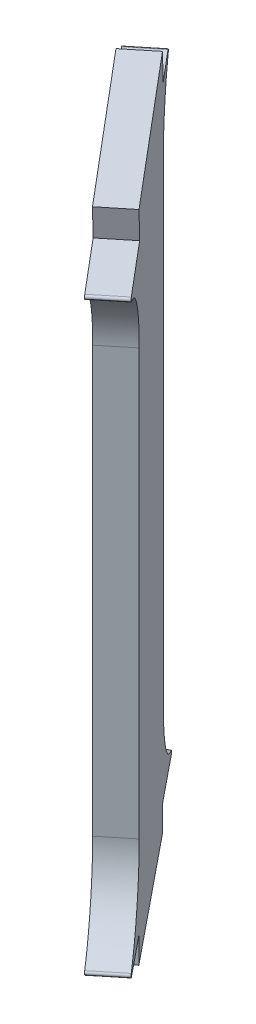
ISO-10303-21;
HEADER;
FILE_DESCRIPTION(('STEP AP214'),'2;1');
FILE_NAME('part.step','',(''),(''),'','','');
FILE_SCHEMA(('AUTOMOTIVE_DESIGN { 1 0 10303 214 1 1 1 1 }'));
ENDSEC;
DATA;
#1=APPLICATION_CONTEXT('core data for automotive mechanical design processes');
#2=APPLICATION_PROTOCOL_DEFINITION('international standard','automotive_design',2000,#1);
#3=PRODUCT_CONTEXT('',#1,'mechanical');
#4=PRODUCT('Part','Part','',(#3));
#5=PRODUCT_RELATED_PRODUCT_CATEGORY('part','',(#4));
#6=PRODUCT_DEFINITION_FORMATION('','',#4);
#7=PRODUCT_DEFINITION_CONTEXT('part definition',#1,'design');
#8=PRODUCT_DEFINITION('design','',#6,#7);
#9=PRODUCT_DEFINITION_SHAPE('','',#8);
#10=(LENGTH_UNIT() NAMED_UNIT(*) SI_UNIT(.MILLI.,.METRE.));
#11=(NAMED_UNIT(*) PLANE_ANGLE_UNIT() SI_UNIT($,.RADIAN.));
#12=(NAMED_UNIT(*) SI_UNIT($,.STERADIAN.) SOLID_ANGLE_UNIT());
#13=UNCERTAINTY_MEASURE_WITH_UNIT(LENGTH_MEASURE(1.E-05),#10,'distance_accuracy_value','');
#14=(GEOMETRIC_REPRESENTATION_CONTEXT(3) GLOBAL_UNCERTAINTY_ASSIGNED_CONTEXT((#13)) GLOBAL_UNIT_ASSIGNED_CONTEXT((#10,
#11,#12)) REPRESENTATION_CONTEXT('',''));
#15=CARTESIAN_POINT('',(0.,0.,0.));
#16=DIRECTION('',(0.,0.,1.));
#17=DIRECTION('',(1.,0.,0.));
#18=AXIS2_PLACEMENT_3D('',#15,#16,#17);
#19=CARTESIAN_POINT('',(-148.625427435059,71.2659206812055,-82.6031276055856));
#20=DIRECTION('',(-0.776187884580817,0.,0.630501679482264));
#21=DIRECTION('',(0.,1.,0.));
#22=AXIS2_PLACEMENT_3D('',#19,#20,#21);
#23=ELLIPSE('',#22,10.0702795953244,10.);
#24=DIRECTION('',(-0.776187884580817,0.,0.630501679482264));
#25=VECTOR('',#24,1.);
#26=SURFACE_OF_LINEAR_EXTRUSION('',#23,#25);
#27=CARTESIAN_POINT('',(-151.730178973383,71.2659206812055,-80.0811208876566));
#28=DIRECTION('',(-0.776187884580817,0.,0.630501679482264));
#29=DIRECTION('',(0.,1.,0.));
#30=AXIS2_PLACEMENT_3D('',#27,#28,#29);
#31=ELLIPSE('',#30,10.0702795953244,10.);
#32=CARTESIAN_POINT('',(-145.42516217856,71.265920681185,-72.3192420418484));
#33=VERTEX_POINT('',#32);
#34=CARTESIAN_POINT('',(-148.00880313571,79.3950440581068,-75.4998692698261));
#35=VERTEX_POINT('',#34);
#36=EDGE_CURVE('E184',#33,#35,#31,.T.);
#37=ORIENTED_EDGE('',*,*,#36,.T.);
#38=DIRECTION('',(-0.776187884580817,0.,0.630501679482264));
#39=VECTOR('',#38,1.);
#40=CARTESIAN_POINT('',(-148.00880313571,79.3950440581068,-75.4998692698261));
#41=LINE('',#40,#39);
#42=CARTESIAN_POINT('',(-144.904051597387,79.3950440581068,-78.0218759877551));
#43=VERTEX_POINT('',#42);
#44=EDGE_CURVE('E270',#35,#43,#41,.F.);
#45=ORIENTED_EDGE('',*,*,#44,.T.);
#46=CARTESIAN_POINT('',(-142.320410640237,71.265920681185,-74.8412487597775));
#47=VERTEX_POINT('',#46);
#48=EDGE_CURVE('E227',#47,#43,#23,.T.);
#49=ORIENTED_EDGE('',*,*,#48,.F.);
#50=DIRECTION('',(0.776187884580817,0.,-0.630501679482264));
#51=VECTOR('',#50,1.);
#52=CARTESIAN_POINT('',(-142.320410640237,71.265920681185,-74.8412487597775));
#53=LINE('',#52,#51);
#54=EDGE_CURVE('E331',#33,#47,#53,.T.);
#55=ORIENTED_EDGE('',*,*,#54,.F.);
#56=EDGE_LOOP('',(#37,#45,#49,#55));
#57=FACE_BOUND('',#56,.T.);
#58=ADVANCED_FACE('F36',(#57),#26,.F.);
#59=CARTESIAN_POINT('',(-123.405360255769,65.417589735172,-51.5556122223529));
#60=DIRECTION('',(-0.776187884580817,0.,0.630501679482264));
#61=DIRECTION('',(0.,-1.,0.));
#62=AXIS2_PLACEMENT_3D('',#59,#60,#61);
#63=ELLIPSE('',#62,10.0702795953244,10.);
#64=DIRECTION('',(-0.776187884580817,0.,0.630501679482264));
#65=VECTOR('',#64,1.);
#66=SURFACE_OF_LINEAR_EXTRUSION('',#63,#65);
#67=CARTESIAN_POINT('',(-125.525555398606,74.9014287887686,-54.1657080180832));
#68=VERTEX_POINT('',#67);
#69=CARTESIAN_POINT('',(-129.710377050591,65.4175897351479,-59.3174910681611));
#70=VERTEX_POINT('',#69);
#71=EDGE_CURVE('E293',#68,#70,#63,.T.);
#72=ORIENTED_EDGE('',*,*,#71,.F.);
#73=DIRECTION('',(-0.776187884580817,0.,0.630501679482264));
#74=VECTOR('',#73,1.);
#75=CARTESIAN_POINT('',(-125.525555398606,74.9014287887686,-54.1657080180832));
#76=LINE('',#75,#74);
#77=CARTESIAN_POINT('',(-128.63030693693,74.9014287887686,-51.6437013001541));
#78=VERTEX_POINT('',#77);
#79=EDGE_CURVE('E44',#68,#78,#76,.T.);
#80=ORIENTED_EDGE('',*,*,#79,.T.);
#81=CARTESIAN_POINT('',(-126.510111794092,65.417589735172,-49.0336055044239));
#82=DIRECTION('',(-0.776187884580817,0.,0.630501679482264));
#83=DIRECTION('',(0.,-1.,0.));
#84=AXIS2_PLACEMENT_3D('',#81,#82,#83);
#85=ELLIPSE('',#84,10.0702795953244,10.);
#86=CARTESIAN_POINT('',(-132.815128588915,65.4175897351479,-56.795484350232));
#87=VERTEX_POINT('',#86);
#88=EDGE_CURVE('E291',#78,#87,#85,.T.);
#89=ORIENTED_EDGE('',*,*,#88,.T.);
#90=DIRECTION('',(0.776187884580817,0.,-0.630501679482264));
#91=VECTOR('',#90,1.);
#92=CARTESIAN_POINT('',(-129.710377050591,65.4175897351479,-59.3174910681611));
#93=LINE('',#92,#91);
#94=EDGE_CURVE('E325',#87,#70,#93,.T.);
#95=ORIENTED_EDGE('',*,*,#94,.T.);
#96=EDGE_LOOP('',(#72,#80,#89,#95));
#97=FACE_BOUND('',#96,.T.);
#98=ADVANCED_FACE('F236',(#97),#66,.F.);
#99=CARTESIAN_POINT('',(-192.,4.1,-136.));
#100=DIRECTION('',(0.,-1.,0.));
#101=DIRECTION('',(0.630501679482264,0.,0.776187884580817));
#102=AXIS2_PLACEMENT_3D('',#99,#100,#101);
#103=PLANE('',#102);
#104=DIRECTION('',(0.630501679482264,0.,0.776187884580817));
#105=VECTOR('',#104,1.);
#106=CARTESIAN_POINT('',(-195.104751538323,4.1,-133.477993282071));
#107=LINE('',#106,#105);
#108=CARTESIAN_POINT('',(-149.551524234372,4.1,-77.3990575908655));
#109=VERTEX_POINT('',#108);
#110=CARTESIAN_POINT('',(-144.896874259221,4.1,-71.6688858320161));
#111=VERTEX_POINT('',#110);
#112=EDGE_CURVE('E313',#109,#111,#107,.T.);
#113=ORIENTED_EDGE('',*,*,#112,.F.);
#114=DIRECTION('',(-0.776187884580817,0.,0.630501679482264));
#115=VECTOR('',#114,1.);
#116=CARTESIAN_POINT('',(-146.446772696049,4.1,-79.9210643087945));
#117=LINE('',#116,#115);
#118=CARTESIAN_POINT('',(-146.446772696049,4.1,-79.9210643087945));
#119=VERTEX_POINT('',#118);
#120=EDGE_CURVE('E282',#109,#119,#117,.F.);
#121=ORIENTED_EDGE('',*,*,#120,.T.);
#122=DIRECTION('',(0.630501679482264,0.,0.776187884580817));
#123=VECTOR('',#122,1.);
#124=CARTESIAN_POINT('',(-192.,4.1,-136.));
#125=LINE('',#124,#123);
#126=CARTESIAN_POINT('',(-141.792122720898,4.1,-74.1908925499451));
#127=VERTEX_POINT('',#126);
#128=EDGE_CURVE('E219',#119,#127,#125,.T.);
#129=ORIENTED_EDGE('',*,*,#128,.T.);
#130=DIRECTION('',(0.776187884580817,0.,-0.630501679482264));
#131=VECTOR('',#130,1.);
#132=CARTESIAN_POINT('',(-141.792122720898,4.1,-74.1908925499451));
#133=LINE('',#132,#131);
#134=EDGE_CURVE('E195',#111,#127,#133,.T.);
#135=ORIENTED_EDGE('',*,*,#134,.F.);
#136=EDGE_LOOP('',(#113,#121,#129,#135));
#137=FACE_BOUND('',#136,.T.);
#138=ADVANCED_FACE('F246',(#137),#103,.T.);
#139=CARTESIAN_POINT('',(-148.625427435059,14.00000000001,-82.6031276055856));
#140=DIRECTION('',(-0.776187884580817,0.,0.630501679482264));
#141=DIRECTION('',(0.630501679482264,0.,0.776187884580817));
#142=AXIS2_PLACEMENT_3D('',#139,#140,#141);
#143=CYLINDRICAL_SURFACE('',#142,10.);
#144=CARTESIAN_POINT('',(-148.625427435059,14.00000000001,-82.6031276055856));
#145=DIRECTION('',(-0.776187884580817,0.,0.630501679482264));
#146=DIRECTION('',(0.630501679482264,0.,0.776187884580817));
#147=AXIS2_PLACEMENT_3D('',#144,#145,#146);
#148=CIRCLE('',#147,10.);
#149=CARTESIAN_POINT('',(-146.499910616513,4.58536585365878,-79.986480486765));
#150=VERTEX_POINT('',#149);
#151=CARTESIAN_POINT('',(-142.320410640237,14.00000000001,-74.8412487597775));
#152=VERTEX_POINT('',#151);
#153=EDGE_CURVE('E221',#150,#152,#148,.T.);
#154=ORIENTED_EDGE('',*,*,#153,.F.);
#155=DIRECTION('',(-0.776187884580817,0.,0.630501679482264));
#156=VECTOR('',#155,1.);
#157=CARTESIAN_POINT('',(-146.499910616513,4.58536585365878,-79.986480486765));
#158=LINE('',#157,#156);
#159=CARTESIAN_POINT('',(-149.604662154836,4.58536585365878,-77.464473768836));
#160=VERTEX_POINT('',#159);
#161=EDGE_CURVE('E285',#150,#160,#158,.T.);
#162=ORIENTED_EDGE('',*,*,#161,.T.);
#163=CARTESIAN_POINT('',(-151.730178973383,14.00000000001,-80.0811208876566));
#164=DIRECTION('',(-0.776187884580817,0.,0.630501679482264));
#165=DIRECTION('',(0.630501679482264,0.,0.776187884580817));
#166=AXIS2_PLACEMENT_3D('',#163,#164,#165);
#167=CIRCLE('',#166,10.);
#168=CARTESIAN_POINT('',(-145.42516217856,14.00000000001,-72.3192420418484));
#169=VERTEX_POINT('',#168);
#170=EDGE_CURVE('E311',#160,#169,#167,.T.);
#171=ORIENTED_EDGE('',*,*,#170,.T.);
#172=DIRECTION('',(0.776187884580817,0.,-0.630501679482264));
#173=VECTOR('',#172,1.);
#174=CARTESIAN_POINT('',(-142.320410640237,14.00000000001,-74.8412487597775));
#175=LINE('',#174,#173);
#176=EDGE_CURVE('E333',#169,#152,#175,.T.);
#177=ORIENTED_EDGE('',*,*,#176,.T.);
#178=EDGE_LOOP('',(#154,#162,#171,#177));
#179=FACE_BOUND('',#178,.T.);
#180=ADVANCED_FACE('F242',(#179),#143,.F.);
#181=CARTESIAN_POINT('',(-142.320410640237,500000.,-74.8412487597775));
#182=DIRECTION('',(-0.630501679482264,0.,-0.776187884580817));
#183=DIRECTION('',(0.,-1.,0.));
#184=AXIS2_PLACEMENT_3D('',#181,#182,#183);
#185=PLANE('',#184);
#186=ORIENTED_EDGE('',*,*,#176,.F.);
#187=DIRECTION('',(0.,1.,0.));
#188=VECTOR('',#187,1.);
#189=CARTESIAN_POINT('',(-145.42516217856,4.,-72.3192420418484));
#190=LINE('',#189,#188);
#191=EDGE_CURVE('E308',#33,#169,#190,.F.);
#192=ORIENTED_EDGE('',*,*,#191,.F.);
#193=ORIENTED_EDGE('',*,*,#54,.T.);
#194=DIRECTION('',(0.,-1.,0.));
#195=VECTOR('',#194,1.);
#196=CARTESIAN_POINT('',(-142.320410640237,500000.,-74.8412487597775));
#197=LINE('',#196,#195);
#198=EDGE_CURVE('E224',#47,#152,#197,.T.);
#199=ORIENTED_EDGE('',*,*,#198,.T.);
#200=EDGE_LOOP('',(#186,#192,#193,#199));
#201=FACE_BOUND('',#200,.T.);
#202=ADVANCED_FACE('F239',(#201),#185,.T.);
#203=CARTESIAN_POINT('',(-150.057830245351,-5.72605217805807,-84.3665070593891));
#204=DIRECTION('',(-0.623868762401143,0.144670153472483,-0.768022339515144));
#205=DIRECTION('',(-0.0912147747353571,-0.989479937489512,-0.112291220385788));
#206=AXIS2_PLACEMENT_3D('',#203,#204,#205);
#207=PLANE('',#206);
#208=DIRECTION('',(-0.0912147747353571,-0.989479937489512,-0.112291220385788));
#209=VECTOR('',#208,1.);
#210=CARTESIAN_POINT('',(-150.057830245351,-5.72605217805807,-84.3665070593891));
#211=LINE('',#210,#209);
#212=CARTESIAN_POINT('',(-141.888727009523,82.8907731398083,-74.3098186065594));
#213=VERTEX_POINT('',#212);
#214=CARTESIAN_POINT('',(-142.224414265649,79.2493038036132,-74.7230710842158));
#215=VERTEX_POINT('',#214);
#216=EDGE_CURVE('E199',#213,#215,#211,.T.);
#217=ORIENTED_EDGE('',*,*,#216,.T.);
#218=DIRECTION('',(0.77618788458082,0.,-0.630501679482261));
#219=VECTOR('',#218,1.);
#220=CARTESIAN_POINT('',(-145.329165803972,79.2493038036132,-72.2010643662867));
#221=LINE('',#220,#219);
#222=CARTESIAN_POINT('',(-145.329165803972,79.2493038036132,-72.2010643662867));
#223=VERTEX_POINT('',#222);
#224=EDGE_CURVE('E190',#223,#215,#221,.T.);
#225=ORIENTED_EDGE('',*,*,#224,.F.);
#226=DIRECTION('',(-0.0912147747353571,-0.989479937489512,-0.112291220385788));
#227=VECTOR('',#226,1.);
#228=CARTESIAN_POINT('',(-153.162581783674,-5.72605217805807,-81.8445003414601));
#229=LINE('',#228,#227);
#230=CARTESIAN_POINT('',(-144.993478547847,82.8907731398083,-71.7878118886303));
#231=VERTEX_POINT('',#230);
#232=EDGE_CURVE('E173',#231,#223,#229,.T.);
#233=ORIENTED_EDGE('',*,*,#232,.F.);
#234=DIRECTION('',(0.776187884580817,0.,-0.630501679482264));
#235=VECTOR('',#234,1.);
#236=CARTESIAN_POINT('',(-141.888727009523,82.8907731398083,-74.3098186065594));
#237=LINE('',#236,#235);
#238=EDGE_CURVE('E329',#231,#213,#237,.T.);
#239=ORIENTED_EDGE('',*,*,#238,.T.);
#240=EDGE_LOOP('',(#217,#225,#233,#239));
#241=FACE_BOUND('',#240,.T.);
#242=ADVANCED_FACE('F197',(#241),#207,.T.);
#243=CARTESIAN_POINT('',(-141.888727009523,82.8907731398083,-74.3098186065594));
#244=DIRECTION('',(-0.091214774735358,-0.989479937489512,-0.112291220385789));
#245=DIRECTION('',(0.623868762401143,-0.144670153472484,0.768022339515143));
#246=AXIS2_PLACEMENT_3D('',#243,#244,#245);
#247=PLANE('',#246);
#248=ORIENTED_EDGE('',*,*,#238,.F.);
#249=DIRECTION('',(0.623868762401143,-0.144670153472484,0.768022339515143));
#250=VECTOR('',#249,1.);
#251=CARTESIAN_POINT('',(-144.993478547847,82.8907731398083,-71.7878118886303));
#252=LINE('',#251,#250);
#253=CARTESIAN_POINT('',(-132.703263928544,80.0407711164004,-56.6577718001821));
#254=VERTEX_POINT('',#253);
#255=EDGE_CURVE('E181',#231,#254,#252,.T.);
#256=ORIENTED_EDGE('',*,*,#255,.T.);
#257=DIRECTION('',(0.776187884580817,0.,-0.630501679482264));
#258=VECTOR('',#257,1.);
#259=CARTESIAN_POINT('',(-129.598512390221,80.0407711164004,-59.1797785181111));
#260=LINE('',#259,#258);
#261=CARTESIAN_POINT('',(-129.598512390221,80.0407711164004,-59.1797785181111));
#262=VERTEX_POINT('',#261);
#263=EDGE_CURVE('E327',#254,#262,#260,.T.);
#264=ORIENTED_EDGE('',*,*,#263,.T.);
#265=DIRECTION('',(0.623868762401143,-0.144670153472484,0.768022339515143));
#266=VECTOR('',#265,1.);
#267=CARTESIAN_POINT('',(-141.888727009523,82.8907731398083,-74.3098186065594));
#268=LINE('',#267,#266);
#269=EDGE_CURVE('E402',#213,#262,#268,.T.);
#270=ORIENTED_EDGE('',*,*,#269,.F.);
#271=EDGE_LOOP('',(#248,#256,#264,#270));
#272=FACE_BOUND('',#271,.T.);
#273=ADVANCED_FACE('F405',(#272),#247,.F.);
#274=CARTESIAN_POINT('',(-137.767615626048,-8.57605420146593,-69.2364669709408));
#275=DIRECTION('',(0.623868762401143,-0.144670153472482,0.768022339515144));
#276=DIRECTION('',(0.0912147747353567,0.989479937489512,0.112291220385788));
#277=AXIS2_PLACEMENT_3D('',#274,#275,#276);
#278=PLANE('',#277);
#279=ORIENTED_EDGE('',*,*,#263,.F.);
#280=DIRECTION('',(0.0912147747353567,0.989479937489512,0.112291220385788));
#281=VECTOR('',#280,1.);
#282=CARTESIAN_POINT('',(-140.872367164371,-8.57605420146593,-66.7144602530117));
#283=LINE('',#282,#281);
#284=CARTESIAN_POINT('',(-133.038951184669,76.3993017802053,-57.0710242778384));
#285=VERTEX_POINT('',#284);
#286=EDGE_CURVE('E299',#285,#254,#283,.T.);
#287=ORIENTED_EDGE('',*,*,#286,.F.);
#288=DIRECTION('',(-0.776187884580818,0.,0.630501679482263));
#289=VECTOR('',#288,1.);
#290=CARTESIAN_POINT('',(-129.934199646346,76.3993017802053,-59.5930309957674));
#291=LINE('',#290,#289);
#292=CARTESIAN_POINT('',(-129.934199646346,76.3993017802053,-59.5930309957674));
#293=VERTEX_POINT('',#292);
#294=EDGE_CURVE('E203',#293,#285,#291,.T.);
#295=ORIENTED_EDGE('',*,*,#294,.F.);
#296=DIRECTION('',(0.0912147747353567,0.989479937489512,0.112291220385788));
#297=VECTOR('',#296,1.);
#298=CARTESIAN_POINT('',(-137.767615626048,-8.57605420146593,-69.2364669709408));
#299=LINE('',#298,#297);
#300=EDGE_CURVE('E406',#293,#262,#299,.T.);
#301=ORIENTED_EDGE('',*,*,#300,.T.);
#302=EDGE_LOOP('',(#279,#287,#295,#301));
#303=FACE_BOUND('',#302,.T.);
#304=ADVANCED_FACE('F415',(#303),#278,.T.);
#305=CARTESIAN_POINT('',(-129.710377050591,500000.,-59.3174910681611));
#306=DIRECTION('',(-0.630501679482264,0.,-0.776187884580817));
#307=DIRECTION('',(0.,-1.,0.));
#308=AXIS2_PLACEMENT_3D('',#305,#306,#307);
#309=PLANE('',#308);
#310=ORIENTED_EDGE('',*,*,#94,.F.);
#311=DIRECTION('',(0.,1.,0.));
#312=VECTOR('',#311,1.);
#313=CARTESIAN_POINT('',(-132.815128588915,4.,-56.795484350232));
#314=LINE('',#313,#312);
#315=CARTESIAN_POINT('',(-132.815128588915,14.00000000001,-56.795484350232));
#316=VERTEX_POINT('',#315);
#317=EDGE_CURVE('E298',#87,#316,#314,.F.);
#318=ORIENTED_EDGE('',*,*,#317,.T.);
#319=DIRECTION('',(0.776187884580817,0.,-0.630501679482264));
#320=VECTOR('',#319,1.);
#321=CARTESIAN_POINT('',(-129.710377050591,14.00000000001,-59.3174910681611));
#322=LINE('',#321,#320);
#323=CARTESIAN_POINT('',(-129.710377050591,14.00000000001,-59.3174910681611));
#324=VERTEX_POINT('',#323);
#325=EDGE_CURVE('E323',#316,#324,#322,.T.);
#326=ORIENTED_EDGE('',*,*,#325,.T.);
#327=DIRECTION('',(0.,-1.,0.));
#328=VECTOR('',#327,1.);
#329=CARTESIAN_POINT('',(-129.710377050591,500000.,-59.3174910681611));
#330=LINE('',#329,#328);
#331=EDGE_CURVE('E371',#70,#324,#330,.T.);
#332=ORIENTED_EDGE('',*,*,#331,.F.);
#333=EDGE_LOOP('',(#310,#318,#326,#332));
#334=FACE_BOUND('',#333,.T.);
#335=ADVANCED_FACE('F413',(#334),#309,.F.);
#336=CARTESIAN_POINT('',(-123.405360255769,14.00000000001,-51.5556122223529));
#337=DIRECTION('',(-0.776187884580817,0.,0.630501679482264));
#338=DIRECTION('',(0.630501679482264,0.,0.776187884580817));
#339=AXIS2_PLACEMENT_3D('',#336,#337,#338);
#340=CYLINDRICAL_SURFACE('',#339,10.);
#341=CARTESIAN_POINT('',(-126.510111794092,14.00000000001,-49.0336055044239));
#342=DIRECTION('',(-0.776187884580817,0.,0.630501679482264));
#343=DIRECTION('',(0.630501679482264,0.,0.776187884580817));
#344=AXIS2_PLACEMENT_3D('',#341,#342,#343);
#345=CIRCLE('',#344,10.);
#346=CARTESIAN_POINT('',(-128.635628612639,4.58536585365878,-51.6502526232445));
#347=VERTEX_POINT('',#346);
#348=EDGE_CURVE('E301',#316,#347,#345,.T.);
#349=ORIENTED_EDGE('',*,*,#348,.T.);
#350=DIRECTION('',(-0.776187884580817,0.,0.630501679482264));
#351=VECTOR('',#350,1.);
#352=CARTESIAN_POINT('',(-125.530877074316,4.58536585365878,-54.1722593411735));
#353=LINE('',#352,#351);
#354=CARTESIAN_POINT('',(-125.530877074316,4.58536585365878,-54.1722593411735));
#355=VERTEX_POINT('',#354);
#356=EDGE_CURVE('E194',#347,#355,#353,.F.);
#357=ORIENTED_EDGE('',*,*,#356,.T.);
#358=CARTESIAN_POINT('',(-123.405360255769,14.00000000001,-51.5556122223529));
#359=DIRECTION('',(-0.776187884580817,0.,0.630501679482264));
#360=DIRECTION('',(0.630501679482264,0.,0.776187884580817));
#361=AXIS2_PLACEMENT_3D('',#358,#359,#360);
#362=CIRCLE('',#361,10.);
#363=EDGE_CURVE('E367',#324,#355,#362,.T.);
#364=ORIENTED_EDGE('',*,*,#363,.F.);
#365=ORIENTED_EDGE('',*,*,#325,.F.);
#366=EDGE_LOOP('',(#349,#357,#364,#365));
#367=FACE_BOUND('',#366,.T.);
#368=ADVANCED_FACE('F366',(#367),#340,.F.);
#369=CARTESIAN_POINT('',(-129.503925310562,4.1,-59.0633357747234));
#370=VERTEX_POINT('',#369);
#371=CARTESIAN_POINT('',(-125.584014994779,4.1,-54.237675519144));
#372=VERTEX_POINT('',#371);
#373=EDGE_CURVE('E222',#370,#372,#125,.T.);
#374=ORIENTED_EDGE('',*,*,#373,.T.);
#375=DIRECTION('',(-0.776187884580817,0.,0.630501679482264));
#376=VECTOR('',#375,1.);
#377=CARTESIAN_POINT('',(-125.584014994779,4.1,-54.237675519144));
#378=LINE('',#377,#376);
#379=CARTESIAN_POINT('',(-128.688766533103,4.1,-51.715668801215));
#380=VERTEX_POINT('',#379);
#381=EDGE_CURVE('E277',#372,#380,#378,.T.);
#382=ORIENTED_EDGE('',*,*,#381,.T.);
#383=DIRECTION('',(0.630501679482264,0.,0.776187884580817));
#384=VECTOR('',#383,1.);
#385=CARTESIAN_POINT('',(-195.104751538323,4.1,-133.477993282071));
#386=LINE('',#385,#384);
#387=CARTESIAN_POINT('',(-132.608676848885,4.1,-56.5413290567943));
#388=VERTEX_POINT('',#387);
#389=EDGE_CURVE('E354',#388,#380,#386,.T.);
#390=ORIENTED_EDGE('',*,*,#389,.F.);
#391=DIRECTION('',(0.776187884580817,0.,-0.630501679482264));
#392=VECTOR('',#391,1.);
#393=CARTESIAN_POINT('',(-129.503925310562,4.1,-59.0633357747234));
#394=LINE('',#393,#392);
#395=EDGE_CURVE('E320',#388,#370,#394,.T.);
#396=ORIENTED_EDGE('',*,*,#395,.T.);
#397=EDGE_LOOP('',(#374,#382,#390,#396));
#398=FACE_BOUND('',#397,.T.);
#399=ADVANCED_FACE('F353',(#398),#103,.T.);
#400=CARTESIAN_POINT('',(-129.503925310562,4.,-59.0633357747234));
#401=DIRECTION('',(-0.630501679482264,0.,-0.776187884580817));
#402=DIRECTION('',(0.,-1.,0.));
#403=AXIS2_PLACEMENT_3D('',#400,#401,#402);
#404=PLANE('',#403);
#405=ORIENTED_EDGE('',*,*,#395,.F.);
#406=DIRECTION('',(0.,1.,0.));
#407=VECTOR('',#406,1.);
#408=CARTESIAN_POINT('',(-132.608676848885,4.,-56.5413290567943));
#409=LINE('',#408,#407);
#410=CARTESIAN_POINT('',(-132.608676848885,1.,-56.5413290567943));
#411=VERTEX_POINT('',#410);
#412=EDGE_CURVE('E216',#388,#411,#409,.F.);
#413=ORIENTED_EDGE('',*,*,#412,.T.);
#414=DIRECTION('',(0.776187884580817,0.,-0.630501679482264));
#415=VECTOR('',#414,1.);
#416=CARTESIAN_POINT('',(-129.503925310562,1.,-59.0633357747234));
#417=LINE('',#416,#415);
#418=CARTESIAN_POINT('',(-129.503925310562,1.,-59.0633357747234));
#419=VERTEX_POINT('',#418);
#420=EDGE_CURVE('E318',#411,#419,#417,.T.);
#421=ORIENTED_EDGE('',*,*,#420,.T.);
#422=DIRECTION('',(0.,-1.,0.));
#423=VECTOR('',#422,1.);
#424=CARTESIAN_POINT('',(-129.503925310562,4.,-59.0633357747234));
#425=LINE('',#424,#423);
#426=EDGE_CURVE('E338',#370,#419,#425,.T.);
#427=ORIENTED_EDGE('',*,*,#426,.F.);
#428=EDGE_LOOP('',(#405,#413,#421,#427));
#429=FACE_BOUND('',#428,.T.);
#430=ADVANCED_FACE('F380',(#429),#404,.F.);
#431=CARTESIAN_POINT('',(-192.,1.,-136.));
#432=DIRECTION('',(0.,-1.,0.));
#433=DIRECTION('',(0.630501679482264,0.,0.776187884580817));
#434=AXIS2_PLACEMENT_3D('',#431,#432,#433);
#435=PLANE('',#434);
#436=ORIENTED_EDGE('',*,*,#420,.F.);
#437=DIRECTION('',(0.630501679482264,0.,0.776187884580817));
#438=VECTOR('',#437,1.);
#439=CARTESIAN_POINT('',(-195.104751538323,1.,-133.477993282071));
#440=LINE('',#439,#438);
#441=CARTESIAN_POINT('',(-144.896874259221,1.,-71.6688858320161));
#442=VERTEX_POINT('',#441);
#443=EDGE_CURVE('E211',#442,#411,#440,.T.);
#444=ORIENTED_EDGE('',*,*,#443,.F.);
#445=DIRECTION('',(0.776187884580817,0.,-0.630501679482264));
#446=VECTOR('',#445,1.);
#447=CARTESIAN_POINT('',(-141.792122720898,1.,-74.1908925499452));
#448=LINE('',#447,#446);
#449=CARTESIAN_POINT('',(-141.792122720898,1.,-74.1908925499452));
#450=VERTEX_POINT('',#449);
#451=EDGE_CURVE('E321',#442,#450,#448,.T.);
#452=ORIENTED_EDGE('',*,*,#451,.T.);
#453=DIRECTION('',(0.630501679482264,0.,0.776187884580817));
#454=VECTOR('',#453,1.);
#455=CARTESIAN_POINT('',(-192.,1.,-136.));
#456=LINE('',#455,#454);
#457=EDGE_CURVE('E212',#450,#419,#456,.T.);
#458=ORIENTED_EDGE('',*,*,#457,.T.);
#459=EDGE_LOOP('',(#436,#444,#452,#458));
#460=FACE_BOUND('',#459,.T.);
#461=ADVANCED_FACE('F252',(#460),#435,.T.);
#462=CARTESIAN_POINT('',(-141.792122720898,4.,-74.1908925499451));
#463=DIRECTION('',(0.630501679482264,0.,0.776187884580817));
#464=DIRECTION('',(0.,1.,0.));
#465=AXIS2_PLACEMENT_3D('',#462,#463,#464);
#466=PLANE('',#465);
#467=DIRECTION('',(0.,1.,0.));
#468=VECTOR('',#467,1.);
#469=CARTESIAN_POINT('',(-144.896874259221,4.,-71.6688858320161));
#470=LINE('',#469,#468);
#471=EDGE_CURVE('E315',#442,#111,#470,.T.);
#472=ORIENTED_EDGE('',*,*,#471,.T.);
#473=ORIENTED_EDGE('',*,*,#134,.T.);
#474=DIRECTION('',(0.,1.,0.));
#475=VECTOR('',#474,1.);
#476=CARTESIAN_POINT('',(-141.792122720898,4.,-74.1908925499451));
#477=LINE('',#476,#475);
#478=EDGE_CURVE('E215',#450,#127,#477,.T.);
#479=ORIENTED_EDGE('',*,*,#478,.F.);
#480=ORIENTED_EDGE('',*,*,#451,.F.);
#481=EDGE_LOOP('',(#472,#473,#479,#480));
#482=FACE_BOUND('',#481,.T.);
#483=ADVANCED_FACE('F248',(#482),#466,.F.);
#484=CARTESIAN_POINT('',(-192.,4.,-136.));
#485=DIRECTION('',(-0.776187884580817,0.,0.630501679482264));
#486=DIRECTION('',(0.630501679482264,0.,0.776187884580817));
#487=AXIS2_PLACEMENT_3D('',#484,#485,#486);
#488=PLANE('',#487);
#489=ORIENTED_EDGE('',*,*,#363,.T.);
#490=CARTESIAN_POINT('',(-125.584014994779,4.35,-54.237675519144));
#491=DIRECTION('',(-0.776187884580817,0.,0.630501679482264));
#492=DIRECTION('',(0.630501679482264,0.,0.776187884580817));
#493=AXIS2_PLACEMENT_3D('',#490,#491,#492);
#494=CIRCLE('',#493,0.25);
#495=EDGE_CURVE('E348',#355,#372,#494,.F.);
#496=ORIENTED_EDGE('',*,*,#495,.T.);
#497=ORIENTED_EDGE('',*,*,#373,.F.);
#498=ORIENTED_EDGE('',*,*,#426,.T.);
#499=ORIENTED_EDGE('',*,*,#457,.F.);
#500=ORIENTED_EDGE('',*,*,#478,.T.);
#501=ORIENTED_EDGE('',*,*,#128,.F.);
#502=CARTESIAN_POINT('',(-146.446772696049,4.35,-79.9210643087945));
#503=DIRECTION('',(-0.776187884580817,0.,0.630501679482264));
#504=DIRECTION('',(0.630501679482264,0.,0.776187884580817));
#505=AXIS2_PLACEMENT_3D('',#502,#503,#504);
#506=CIRCLE('',#505,0.25);
#507=EDGE_CURVE('E346',#119,#150,#506,.F.);
#508=ORIENTED_EDGE('',*,*,#507,.T.);
#509=ORIENTED_EDGE('',*,*,#153,.T.);
#510=ORIENTED_EDGE('',*,*,#198,.F.);
#511=ORIENTED_EDGE('',*,*,#48,.T.);
#512=CARTESIAN_POINT('',(-144.810592697142,79.5963598252793,-77.9068221053667));
#513=DIRECTION('',(-0.776187884580817,0.,0.630501679482264));
#514=DIRECTION('',(0.630501679482264,0.,0.776187884580817));
#515=AXIS2_PLACEMENT_3D('',#512,#513,#514);
#516=CIRCLE('',#515,0.25);
#517=CARTESIAN_POINT('',(-144.787789003458,79.8437298096517,-77.8787493002703));
#518=VERTEX_POINT('',#517);
#519=EDGE_CURVE('E344',#43,#518,#516,.F.);
#520=ORIENTED_EDGE('',*,*,#519,.T.);
#521=DIRECTION('',(-0.623868762401145,0.144670153472482,-0.768022339515142));
#522=VECTOR('',#521,1.);
#523=CARTESIAN_POINT('',(-142.224414265649,79.2493038036132,-74.7230710842158));
#524=LINE('',#523,#522);
#525=EDGE_CURVE('E201',#215,#518,#524,.T.);
#526=ORIENTED_EDGE('',*,*,#525,.F.);
#527=ORIENTED_EDGE('',*,*,#216,.F.);
#528=ORIENTED_EDGE('',*,*,#269,.T.);
#529=ORIENTED_EDGE('',*,*,#300,.F.);
#530=DIRECTION('',(-0.623868762401147,0.144670153472482,-0.768022339515141));
#531=VECTOR('',#530,1.);
#532=CARTESIAN_POINT('',(-123.443437759468,74.8941462492344,-51.6024880642549));
#533=LINE('',#532,#531);
#534=CARTESIAN_POINT('',(-125.556086581904,75.3840525368949,-54.2032938570251));
#535=VERTEX_POINT('',#534);
#536=EDGE_CURVE('E200',#535,#293,#533,.T.);
#537=ORIENTED_EDGE('',*,*,#536,.F.);
#538=CARTESIAN_POINT('',(-125.578890275588,75.1366825525225,-54.2313666621215));
#539=DIRECTION('',(-0.776187884580817,0.,0.630501679482264));
#540=DIRECTION('',(0.630501679482264,0.,0.776187884580817));
#541=AXIS2_PLACEMENT_3D('',#538,#539,#540);
#542=CIRCLE('',#541,0.25);
#543=EDGE_CURVE('E342',#535,#68,#542,.F.);
#544=ORIENTED_EDGE('',*,*,#543,.T.);
#545=ORIENTED_EDGE('',*,*,#71,.T.);
#546=ORIENTED_EDGE('',*,*,#331,.T.);
#547=EDGE_LOOP('',(#489,#496,#497,#498,#499,#500,#501,#508,#509,#510,#511,#520,#526,#527,#528,
#529,#537,#544,#545,#546));
#548=FACE_BOUND('',#547,.T.);
#549=ADVANCED_FACE('F251',(#548),#488,.F.);
#550=CARTESIAN_POINT('',(-195.104751538323,4.,-133.477993282071));
#551=DIRECTION('',(-0.776187884580817,0.,0.630501679482264));
#552=DIRECTION('',(0.630501679482264,0.,0.776187884580817));
#553=AXIS2_PLACEMENT_3D('',#550,#551,#552);
#554=PLANE('',#553);
#555=ORIENTED_EDGE('',*,*,#389,.T.);
#556=CARTESIAN_POINT('',(-128.688766533103,4.35,-51.715668801215));
#557=DIRECTION('',(-0.776187884580817,0.,0.630501679482264));
#558=DIRECTION('',(0.630501679482264,0.,0.776187884580817));
#559=AXIS2_PLACEMENT_3D('',#556,#557,#558);
#560=CIRCLE('',#559,0.25);
#561=EDGE_CURVE('E275',#380,#347,#560,.T.);
#562=ORIENTED_EDGE('',*,*,#561,.T.);
#563=ORIENTED_EDGE('',*,*,#348,.F.);
#564=ORIENTED_EDGE('',*,*,#317,.F.);
#565=ORIENTED_EDGE('',*,*,#88,.F.);
#566=CARTESIAN_POINT('',(-128.683641813911,75.1366825525225,-51.7093599441925));
#567=DIRECTION('',(-0.776187884580817,0.,0.630501679482264));
#568=DIRECTION('',(0.630501679482264,0.,0.776187884580817));
#569=AXIS2_PLACEMENT_3D('',#566,#567,#568);
#570=CIRCLE('',#569,0.25);
#571=CARTESIAN_POINT('',(-128.660838120227,75.3840525368949,-51.681287139096));
#572=VERTEX_POINT('',#571);
#573=EDGE_CURVE('E51',#78,#572,#570,.T.);
#574=ORIENTED_EDGE('',*,*,#573,.T.);
#575=DIRECTION('',(0.623868762401143,-0.144670153472482,0.768022339515143));
#576=VECTOR('',#575,1.);
#577=CARTESIAN_POINT('',(-133.038951184669,76.3993017802053,-57.0710242778384));
#578=LINE('',#577,#576);
#579=EDGE_CURVE('E209',#285,#572,#578,.T.);
#580=ORIENTED_EDGE('',*,*,#579,.F.);
#581=ORIENTED_EDGE('',*,*,#286,.T.);
#582=ORIENTED_EDGE('',*,*,#255,.F.);
#583=ORIENTED_EDGE('',*,*,#232,.T.);
#584=DIRECTION('',(-0.623868762401143,0.144670153472482,-0.768022339515144));
#585=VECTOR('',#584,1.);
#586=CARTESIAN_POINT('',(-187.271335558621,88.9753559816712,-123.834557306898));
#587=LINE('',#586,#585);
#588=CARTESIAN_POINT('',(-147.892540541781,79.8437298096517,-75.3567425823412));
#589=VERTEX_POINT('',#588);
#590=EDGE_CURVE('E177',#223,#589,#587,.T.);
#591=ORIENTED_EDGE('',*,*,#590,.T.);
#592=CARTESIAN_POINT('',(-147.915344235465,79.5963598252793,-75.3848153874377));
#593=DIRECTION('',(-0.776187884580817,0.,0.630501679482264));
#594=DIRECTION('',(0.630501679482264,0.,0.776187884580817));
#595=AXIS2_PLACEMENT_3D('',#592,#593,#594);
#596=CIRCLE('',#595,0.25);
#597=EDGE_CURVE('E268',#589,#35,#596,.T.);
#598=ORIENTED_EDGE('',*,*,#597,.T.);
#599=ORIENTED_EDGE('',*,*,#36,.F.);
#600=ORIENTED_EDGE('',*,*,#191,.T.);
#601=ORIENTED_EDGE('',*,*,#170,.F.);
#602=CARTESIAN_POINT('',(-149.551524234372,4.35,-77.3990575908655));
#603=DIRECTION('',(-0.776187884580817,0.,0.630501679482264));
#604=DIRECTION('',(0.630501679482264,0.,0.776187884580817));
#605=AXIS2_PLACEMENT_3D('',#602,#603,#604);
#606=CIRCLE('',#605,0.25);
#607=EDGE_CURVE('E273',#160,#109,#606,.T.);
#608=ORIENTED_EDGE('',*,*,#607,.T.);
#609=ORIENTED_EDGE('',*,*,#112,.T.);
#610=ORIENTED_EDGE('',*,*,#471,.F.);
#611=ORIENTED_EDGE('',*,*,#443,.T.);
#612=ORIENTED_EDGE('',*,*,#412,.F.);
#613=EDGE_LOOP('',(#555,#562,#563,#564,#565,#574,#580,#581,#582,#583,#591,#598,#599,#600,#601,
#608,#609,#610,#611,#612));
#614=FACE_BOUND('',#613,.T.);
#615=ADVANCED_FACE('F176',(#614),#554,.T.);
#616=CARTESIAN_POINT('',(5.20397469452513,56.4516940416208,6.40642561471433));
#617=DIRECTION('',(0.0912147747353568,0.989479937489512,0.112291220385788));
#618=DIRECTION('',(0.,-0.112761294803861,0.993622106433908));
#619=AXIS2_PLACEMENT_3D('',#616,#617,#618);
#620=PLANE('',#619);
#621=ORIENTED_EDGE('',*,*,#579,.T.);
#622=DIRECTION('',(-0.776187884580817,0.,0.630501679482264));
#623=VECTOR('',#622,1.);
#624=CARTESIAN_POINT('',(-76.4390372210463,75.3840525368949,-94.1013426779734));
#625=LINE('',#624,#623);
#626=EDGE_CURVE('E11',#572,#535,#625,.F.);
#627=ORIENTED_EDGE('',*,*,#626,.T.);
#628=ORIENTED_EDGE('',*,*,#536,.T.);
#629=ORIENTED_EDGE('',*,*,#294,.T.);
#630=EDGE_LOOP('',(#621,#627,#628,#629));
#631=FACE_BOUND('',#630,.T.);
#632=ADVANCED_FACE('F500',(#631),#620,.T.);
#633=CARTESIAN_POINT('',(5.20397469452514,56.4516940416209,6.40642561471428));
#634=DIRECTION('',(0.091214774735357,0.989479937489512,0.112291220385787));
#635=DIRECTION('',(0.,-0.11276129480386,0.993622106433908));
#636=AXIS2_PLACEMENT_3D('',#633,#634,#635);
#637=PLANE('',#636);
#638=ORIENTED_EDGE('',*,*,#525,.T.);
#639=DIRECTION('',(-0.776187884580817,0.,0.630501679482264));
#640=VECTOR('',#639,1.);
#641=CARTESIAN_POINT('',(-95.6707396426,79.8437298096517,-117.776798121219));
#642=LINE('',#641,#640);
#643=EDGE_CURVE('E193',#518,#589,#642,.T.);
#644=ORIENTED_EDGE('',*,*,#643,.T.);
#645=ORIENTED_EDGE('',*,*,#590,.F.);
#646=ORIENTED_EDGE('',*,*,#224,.T.);
#647=EDGE_LOOP('',(#638,#644,#645,#646));
#648=FACE_BOUND('',#647,.T.);
#649=ADVANCED_FACE('F189',(#648),#637,.T.);
#650=CARTESIAN_POINT('',(-125.584014994779,4.35,-54.237675519144));
#651=DIRECTION('',(-0.776187884580817,0.,0.630501679482264));
#652=DIRECTION('',(0.630501679482264,0.,0.776187884580817));
#653=AXIS2_PLACEMENT_3D('',#650,#651,#652);
#654=CYLINDRICAL_SURFACE('',#653,0.25);
#655=ORIENTED_EDGE('',*,*,#561,.F.);
#656=ORIENTED_EDGE('',*,*,#381,.F.);
#657=ORIENTED_EDGE('',*,*,#495,.F.);
#658=ORIENTED_EDGE('',*,*,#356,.F.);
#659=EDGE_LOOP('',(#655,#656,#657,#658));
#660=FACE_BOUND('',#659,.T.);
#661=ADVANCED_FACE('F254',(#660),#654,.T.);
#662=CARTESIAN_POINT('',(-146.446772696049,4.35,-79.9210643087945));
#663=DIRECTION('',(-0.776187884580817,0.,0.630501679482264));
#664=DIRECTION('',(0.630501679482264,0.,0.776187884580817));
#665=AXIS2_PLACEMENT_3D('',#662,#663,#664);
#666=CYLINDRICAL_SURFACE('',#665,0.25);
#667=ORIENTED_EDGE('',*,*,#607,.F.);
#668=ORIENTED_EDGE('',*,*,#161,.F.);
#669=ORIENTED_EDGE('',*,*,#507,.F.);
#670=ORIENTED_EDGE('',*,*,#120,.F.);
#671=EDGE_LOOP('',(#667,#668,#669,#670));
#672=FACE_BOUND('',#671,.T.);
#673=ADVANCED_FACE('F257',(#672),#666,.T.);
#674=CARTESIAN_POINT('',(-146.362968466303,79.5963598252793,-76.6458187464022));
#675=DIRECTION('',(-0.776187884580817,0.,0.630501679482264));
#676=DIRECTION('',(0.630501679482264,0.,0.776187884580817));
#677=AXIS2_PLACEMENT_3D('',#674,#675,#676);
#678=CYLINDRICAL_SURFACE('',#677,0.25);
#679=ORIENTED_EDGE('',*,*,#597,.F.);
#680=ORIENTED_EDGE('',*,*,#643,.F.);
#681=ORIENTED_EDGE('',*,*,#519,.F.);
#682=ORIENTED_EDGE('',*,*,#44,.F.);
#683=EDGE_LOOP('',(#679,#680,#681,#682));
#684=FACE_BOUND('',#683,.T.);
#685=ADVANCED_FACE('F260',(#684),#678,.T.);
#686=CARTESIAN_POINT('',(-127.131266044749,75.1366825525225,-52.970363303157));
#687=DIRECTION('',(-0.776187884580817,0.,0.630501679482264));
#688=DIRECTION('',(0.630501679482264,0.,0.776187884580817));
#689=AXIS2_PLACEMENT_3D('',#686,#687,#688);
#690=CYLINDRICAL_SURFACE('',#689,0.25);
#691=ORIENTED_EDGE('',*,*,#543,.F.);
#692=ORIENTED_EDGE('',*,*,#626,.F.);
#693=ORIENTED_EDGE('',*,*,#573,.F.);
#694=ORIENTED_EDGE('',*,*,#79,.F.);
#695=EDGE_LOOP('',(#691,#692,#693,#694));
#696=FACE_BOUND('',#695,.T.);
#697=ADVANCED_FACE('F38',(#696),#690,.T.);
#698=CLOSED_SHELL('',(#58,#98,#138,#180,#202,#242,#273,#304,#335,#368,#399,#430,#461,#483,#549,
#615,#632,#649,#661,#673,#685,#697));
#699=MANIFOLD_SOLID_BREP('B2',#698);
#700=ADVANCED_BREP_SHAPE_REPRESENTATION('',(#18,#699),#14);
#701=SHAPE_DEFINITION_REPRESENTATION(#9,#700);
ENDSEC;
END-ISO-10303-21;
